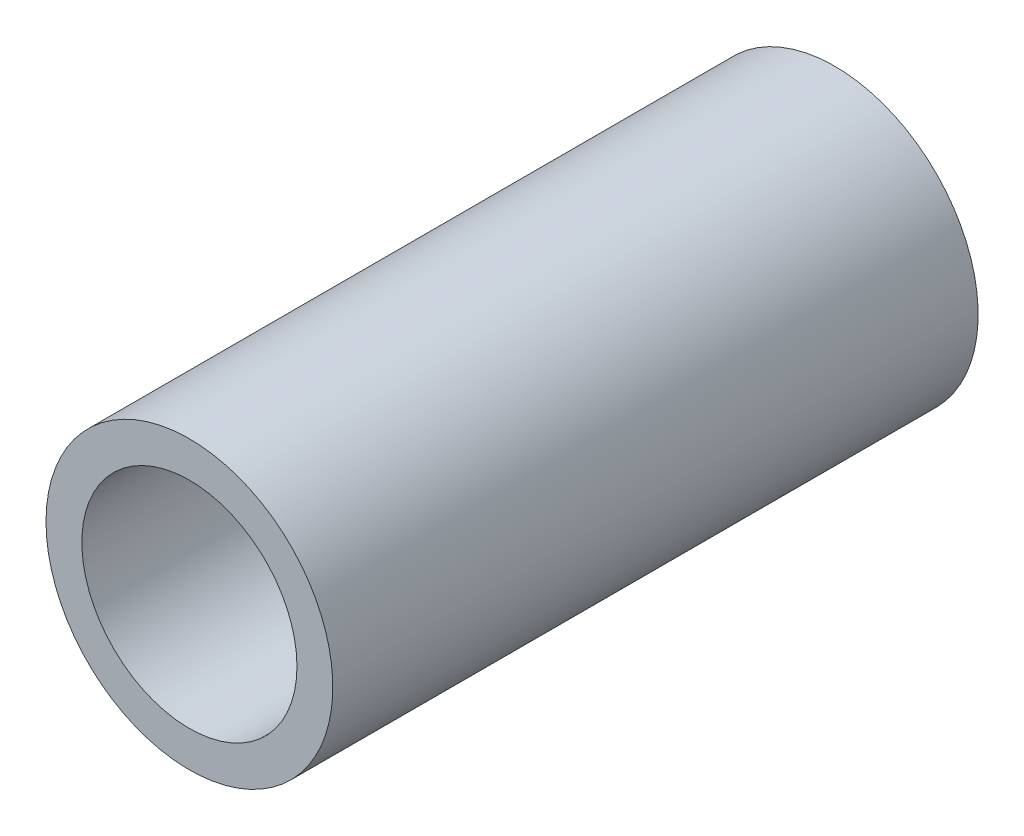
ISO-10303-21;
HEADER;
FILE_DESCRIPTION(('STEP AP214'),'2;1');
FILE_NAME('part.step','',(''),(''),'','','');
FILE_SCHEMA(('AUTOMOTIVE_DESIGN { 1 0 10303 214 1 1 1 1 }'));
ENDSEC;
DATA;
#1=APPLICATION_CONTEXT('core data for automotive mechanical design processes');
#2=APPLICATION_PROTOCOL_DEFINITION('international standard','automotive_design',2000,#1);
#3=PRODUCT_CONTEXT('',#1,'mechanical');
#4=PRODUCT('Part','Part','',(#3));
#5=PRODUCT_RELATED_PRODUCT_CATEGORY('part','',(#4));
#6=PRODUCT_DEFINITION_FORMATION('','',#4);
#7=PRODUCT_DEFINITION_CONTEXT('part definition',#1,'design');
#8=PRODUCT_DEFINITION('design','',#6,#7);
#9=PRODUCT_DEFINITION_SHAPE('','',#8);
#10=(LENGTH_UNIT() NAMED_UNIT(*) SI_UNIT(.MILLI.,.METRE.));
#11=(NAMED_UNIT(*) PLANE_ANGLE_UNIT() SI_UNIT($,.RADIAN.));
#12=(NAMED_UNIT(*) SI_UNIT($,.STERADIAN.) SOLID_ANGLE_UNIT());
#13=UNCERTAINTY_MEASURE_WITH_UNIT(LENGTH_MEASURE(1.E-05),#10,'distance_accuracy_value','');
#14=(GEOMETRIC_REPRESENTATION_CONTEXT(3) GLOBAL_UNCERTAINTY_ASSIGNED_CONTEXT((#13)) GLOBAL_UNIT_ASSIGNED_CONTEXT((#10,
#11,#12)) REPRESENTATION_CONTEXT('',''));
#15=CARTESIAN_POINT('',(0.,0.,0.));
#16=DIRECTION('',(0.,0.,1.));
#17=DIRECTION('',(1.,0.,0.));
#18=AXIS2_PLACEMENT_3D('',#15,#16,#17);
#19=CARTESIAN_POINT('',(0.,0.,90.));
#20=DIRECTION('',(0.,0.,-1.));
#21=DIRECTION('',(-1.,0.,0.));
#22=AXIS2_PLACEMENT_3D('',#19,#20,#21);
#23=CYLINDRICAL_SURFACE('',#22,20.);
#24=CARTESIAN_POINT('',(0.,0.,90.));
#25=DIRECTION('',(0.,0.,1.));
#26=DIRECTION('',(1.,0.,0.));
#27=AXIS2_PLACEMENT_3D('',#24,#25,#26);
#28=CIRCLE('',#27,20.);
#29=CARTESIAN_POINT('',(-20.,0.,90.));
#30=VERTEX_POINT('',#29);
#31=EDGE_CURVE('E10',#30,#30,#28,.T.);
#32=CARTESIAN_POINT('',(0.,0.,0.));
#33=DIRECTION('',(0.,0.,1.));
#34=DIRECTION('',(1.,0.,0.));
#35=AXIS2_PLACEMENT_3D('',#32,#33,#34);
#36=CIRCLE('',#35,20.);
#37=CARTESIAN_POINT('',(-20.,0.,0.));
#38=VERTEX_POINT('',#37);
#39=EDGE_CURVE('E34',#38,#38,#36,.T.);
#40=CARTESIAN_POINT('',(-20.,0.,90.));
#41=CARTESIAN_POINT('',(-20.,0.,89.0625));
#42=CARTESIAN_POINT('',(-20.,0.,88.125));
#43=CARTESIAN_POINT('',(-20.,0.,86.25));
#44=CARTESIAN_POINT('',(-20.,0.,85.3125));
#45=CARTESIAN_POINT('',(-20.,0.,83.4375));
#46=CARTESIAN_POINT('',(-20.,0.,82.5));
#47=CARTESIAN_POINT('',(-20.,0.,80.625));
#48=CARTESIAN_POINT('',(-20.,0.,79.6875));
#49=CARTESIAN_POINT('',(-20.,0.,77.8125));
#50=CARTESIAN_POINT('',(-20.,0.,76.875));
#51=CARTESIAN_POINT('',(-20.,0.,75.));
#52=CARTESIAN_POINT('',(-20.,0.,74.0625));
#53=CARTESIAN_POINT('',(-20.,0.,72.1875));
#54=CARTESIAN_POINT('',(-20.,0.,71.25));
#55=CARTESIAN_POINT('',(-20.,0.,69.375));
#56=CARTESIAN_POINT('',(-20.,0.,68.4375));
#57=CARTESIAN_POINT('',(-20.,0.,66.5625));
#58=CARTESIAN_POINT('',(-20.,0.,65.625));
#59=CARTESIAN_POINT('',(-20.,0.,63.75));
#60=CARTESIAN_POINT('',(-20.,0.,62.8125));
#61=CARTESIAN_POINT('',(-20.,0.,60.9375));
#62=CARTESIAN_POINT('',(-20.,0.,60.));
#63=CARTESIAN_POINT('',(-20.,0.,58.125));
#64=CARTESIAN_POINT('',(-20.,0.,57.1875));
#65=CARTESIAN_POINT('',(-20.,0.,55.3125));
#66=CARTESIAN_POINT('',(-20.,0.,54.375));
#67=CARTESIAN_POINT('',(-20.,0.,52.5));
#68=CARTESIAN_POINT('',(-20.,0.,51.5625));
#69=CARTESIAN_POINT('',(-20.,0.,49.6875));
#70=CARTESIAN_POINT('',(-20.,0.,48.75));
#71=CARTESIAN_POINT('',(-20.,0.,46.875));
#72=CARTESIAN_POINT('',(-20.,0.,45.9375));
#73=CARTESIAN_POINT('',(-20.,0.,44.0625));
#74=CARTESIAN_POINT('',(-20.,0.,43.125));
#75=CARTESIAN_POINT('',(-20.,0.,41.25));
#76=CARTESIAN_POINT('',(-20.,0.,40.3125));
#77=CARTESIAN_POINT('',(-20.,0.,38.4375));
#78=CARTESIAN_POINT('',(-20.,0.,37.5));
#79=CARTESIAN_POINT('',(-20.,0.,35.625));
#80=CARTESIAN_POINT('',(-20.,0.,34.6875));
#81=CARTESIAN_POINT('',(-20.,0.,32.8125));
#82=CARTESIAN_POINT('',(-20.,0.,31.875));
#83=CARTESIAN_POINT('',(-20.,0.,30.));
#84=CARTESIAN_POINT('',(-20.,0.,29.0625));
#85=CARTESIAN_POINT('',(-20.,0.,27.1875));
#86=CARTESIAN_POINT('',(-20.,0.,26.25));
#87=CARTESIAN_POINT('',(-20.,0.,24.375));
#88=CARTESIAN_POINT('',(-20.,0.,23.4375));
#89=CARTESIAN_POINT('',(-20.,0.,21.5625));
#90=CARTESIAN_POINT('',(-20.,0.,20.625));
#91=CARTESIAN_POINT('',(-20.,0.,18.75));
#92=CARTESIAN_POINT('',(-20.,0.,17.8125));
#93=CARTESIAN_POINT('',(-20.,0.,15.9375));
#94=CARTESIAN_POINT('',(-20.,0.,15.));
#95=CARTESIAN_POINT('',(-20.,0.,13.125));
#96=CARTESIAN_POINT('',(-20.,0.,12.1875));
#97=CARTESIAN_POINT('',(-20.,0.,10.3125));
#98=CARTESIAN_POINT('',(-20.,0.,9.37499999999999));
#99=CARTESIAN_POINT('',(-20.,0.,7.49999999999999));
#100=CARTESIAN_POINT('',(-20.,0.,6.56249999999999));
#101=CARTESIAN_POINT('',(-20.,0.,4.68749999999999));
#102=CARTESIAN_POINT('',(-20.,0.,3.74999999999998));
#103=CARTESIAN_POINT('',(-20.,0.,1.87499999999998));
#104=CARTESIAN_POINT('',(-20.,0.,0.937499999999986));
#105=CARTESIAN_POINT('',(-20.,0.,0.));
#106=B_SPLINE_CURVE_WITH_KNOTS('',3,(#40,#41,#42,#43,#44,#45,#46,#47,#48,#49,#50,#51,#52,#53,
#54,#55,#56,#57,#58,#59,#60,#61,#62,#63,#64,#65,#66,#67,#68,#69,#70,#71,#72,#73,#74,#75,#76,#77,
#78,#79,#80,#81,#82,#83,#84,#85,#86,#87,#88,#89,#90,#91,#92,#93,#94,#95,#96,#97,#98,#99,#100,
#101,#102,#103,#104,#105),.UNSPECIFIED.,.F.,.F.,(4,2,2,2,2,2,2,2,2,2,2,2,2,2,2,2,2,2,2,2,2,2,2,
2,2,2,2,2,2,2,2,2,4),(0.,2.81250000000001,5.62500000000001,8.43750000000001,11.25,14.0625,
16.875,19.6875,22.5,25.3125,28.125,30.9375,33.75,36.5625,39.375,42.1875,45.,47.8125,50.625,
53.4375,56.25,59.0625,61.875,64.6875,67.5,70.3125,73.125,75.9375,78.75,81.5625,84.375,87.1875,
90.),.UNSPECIFIED.);
#107=EDGE_CURVE('BSEAM31',#30,#38,#106,.T.);
#108=ORIENTED_EDGE('',*,*,#31,.F.);
#109=ORIENTED_EDGE('',*,*,#39,.T.);
#110=ORIENTED_EDGE('',*,*,#107,.T.);
#111=ORIENTED_EDGE('',*,*,#107,.F.);
#112=EDGE_LOOP('',(#108,#110,#109,#111));
#113=FACE_BOUND('',#112,.T.);
#114=ADVANCED_FACE('F31',(#113),#23,.T.);
#115=CARTESIAN_POINT('',(0.,0.,90.));
#116=DIRECTION('',(0.,0.,1.));
#117=DIRECTION('',(1.,0.,0.));
#118=AXIS2_PLACEMENT_3D('',#115,#116,#117);
#119=PLANE('',#118);
#120=CARTESIAN_POINT('',(0.,0.,90.));
#121=DIRECTION('',(0.,0.,1.));
#122=DIRECTION('',(1.,0.,0.));
#123=AXIS2_PLACEMENT_3D('',#120,#121,#122);
#124=CIRCLE('',#123,15.);
#125=CARTESIAN_POINT('',(15.,0.,90.));
#126=VERTEX_POINT('',#125);
#127=EDGE_CURVE('E43',#126,#126,#124,.T.);
#128=ORIENTED_EDGE('',*,*,#127,.F.);
#129=EDGE_LOOP('',(#128));
#130=FACE_BOUND('',#129,.T.);
#131=ORIENTED_EDGE('',*,*,#31,.T.);
#132=EDGE_LOOP('',(#131));
#133=FACE_BOUND('',#132,.T.);
#134=ADVANCED_FACE('F58',(#130,#133),#119,.T.);
#135=CARTESIAN_POINT('',(0.,0.,0.));
#136=DIRECTION('',(0.,0.,1.));
#137=DIRECTION('',(1.,0.,0.));
#138=AXIS2_PLACEMENT_3D('',#135,#136,#137);
#139=PLANE('',#138);
#140=CARTESIAN_POINT('',(0.,0.,0.));
#141=DIRECTION('',(0.,0.,1.));
#142=DIRECTION('',(1.,0.,0.));
#143=AXIS2_PLACEMENT_3D('',#140,#141,#142);
#144=CIRCLE('',#143,15.);
#145=CARTESIAN_POINT('',(15.,0.,0.));
#146=VERTEX_POINT('',#145);
#147=EDGE_CURVE('E41',#146,#146,#144,.T.);
#148=ORIENTED_EDGE('',*,*,#147,.T.);
#149=EDGE_LOOP('',(#148));
#150=FACE_BOUND('',#149,.T.);
#151=ORIENTED_EDGE('',*,*,#39,.F.);
#152=EDGE_LOOP('',(#151));
#153=FACE_BOUND('',#152,.T.);
#154=ADVANCED_FACE('F49',(#150,#153),#139,.F.);
#155=CARTESIAN_POINT('',(0.,0.,0.));
#156=DIRECTION('',(0.,0.,1.));
#157=DIRECTION('',(1.,0.,0.));
#158=AXIS2_PLACEMENT_3D('',#155,#156,#157);
#159=CYLINDRICAL_SURFACE('',#158,15.);
#160=CARTESIAN_POINT('',(15.,0.,0.));
#161=CARTESIAN_POINT('',(15.,0.,0.937499999999998));
#162=CARTESIAN_POINT('',(15.,0.,1.875));
#163=CARTESIAN_POINT('',(15.,0.,3.75));
#164=CARTESIAN_POINT('',(15.,0.,4.6875));
#165=CARTESIAN_POINT('',(15.,0.,6.5625));
#166=CARTESIAN_POINT('',(15.,0.,7.5));
#167=CARTESIAN_POINT('',(15.,0.,9.375));
#168=CARTESIAN_POINT('',(15.,0.,10.3125));
#169=CARTESIAN_POINT('',(15.,0.,12.1875));
#170=CARTESIAN_POINT('',(15.,0.,13.125));
#171=CARTESIAN_POINT('',(15.,0.,15.));
#172=CARTESIAN_POINT('',(15.,0.,15.9375));
#173=CARTESIAN_POINT('',(15.,0.,17.8125));
#174=CARTESIAN_POINT('',(15.,0.,18.75));
#175=CARTESIAN_POINT('',(15.,0.,20.625));
#176=CARTESIAN_POINT('',(15.,0.,21.5625));
#177=CARTESIAN_POINT('',(15.,0.,23.4375));
#178=CARTESIAN_POINT('',(15.,0.,24.375));
#179=CARTESIAN_POINT('',(15.,0.,26.25));
#180=CARTESIAN_POINT('',(15.,0.,27.1875));
#181=CARTESIAN_POINT('',(15.,0.,29.0625));
#182=CARTESIAN_POINT('',(15.,0.,30.));
#183=CARTESIAN_POINT('',(15.,0.,31.875));
#184=CARTESIAN_POINT('',(15.,0.,32.8125));
#185=CARTESIAN_POINT('',(15.,0.,34.6875));
#186=CARTESIAN_POINT('',(15.,0.,35.625));
#187=CARTESIAN_POINT('',(15.,0.,37.5));
#188=CARTESIAN_POINT('',(15.,0.,38.4375));
#189=CARTESIAN_POINT('',(15.,0.,40.3125));
#190=CARTESIAN_POINT('',(15.,0.,41.25));
#191=CARTESIAN_POINT('',(15.,0.,43.125));
#192=CARTESIAN_POINT('',(15.,0.,44.0625));
#193=CARTESIAN_POINT('',(15.,0.,45.9375));
#194=CARTESIAN_POINT('',(15.,0.,46.875));
#195=CARTESIAN_POINT('',(15.,0.,48.75));
#196=CARTESIAN_POINT('',(15.,0.,49.6875));
#197=CARTESIAN_POINT('',(15.,0.,51.5625));
#198=CARTESIAN_POINT('',(15.,0.,52.5));
#199=CARTESIAN_POINT('',(15.,0.,54.375));
#200=CARTESIAN_POINT('',(15.,0.,55.3125));
#201=CARTESIAN_POINT('',(15.,0.,57.1875));
#202=CARTESIAN_POINT('',(15.,0.,58.125));
#203=CARTESIAN_POINT('',(15.,0.,60.));
#204=CARTESIAN_POINT('',(15.,0.,60.9375));
#205=CARTESIAN_POINT('',(15.,0.,62.8125));
#206=CARTESIAN_POINT('',(15.,0.,63.75));
#207=CARTESIAN_POINT('',(15.,0.,65.625));
#208=CARTESIAN_POINT('',(15.,0.,66.5625));
#209=CARTESIAN_POINT('',(15.,0.,68.4375));
#210=CARTESIAN_POINT('',(15.,0.,69.375));
#211=CARTESIAN_POINT('',(15.,0.,71.25));
#212=CARTESIAN_POINT('',(15.,0.,72.1875));
#213=CARTESIAN_POINT('',(15.,0.,74.0625));
#214=CARTESIAN_POINT('',(15.,0.,75.));
#215=CARTESIAN_POINT('',(15.,0.,76.875));
#216=CARTESIAN_POINT('',(15.,0.,77.8125));
#217=CARTESIAN_POINT('',(15.,0.,79.6875));
#218=CARTESIAN_POINT('',(15.,0.,80.625));
#219=CARTESIAN_POINT('',(15.,0.,82.5));
#220=CARTESIAN_POINT('',(15.,0.,83.4375));
#221=CARTESIAN_POINT('',(15.,0.,85.3125));
#222=CARTESIAN_POINT('',(15.,0.,86.25));
#223=CARTESIAN_POINT('',(15.,0.,88.125));
#224=CARTESIAN_POINT('',(15.,0.,89.0625));
#225=CARTESIAN_POINT('',(15.,0.,90.));
#226=B_SPLINE_CURVE_WITH_KNOTS('',3,(#160,#161,#162,#163,#164,#165,#166,#167,#168,#169,#170,
#171,#172,#173,#174,#175,#176,#177,#178,#179,#180,#181,#182,#183,#184,#185,#186,#187,#188,#189,
#190,#191,#192,#193,#194,#195,#196,#197,#198,#199,#200,#201,#202,#203,#204,#205,#206,#207,#208,
#209,#210,#211,#212,#213,#214,#215,#216,#217,#218,#219,#220,#221,#222,#223,#224,#225),
.UNSPECIFIED.,.F.,.F.,(4,2,2,2,2,2,2,2,2,2,2,2,2,2,2,2,2,2,2,2,2,2,2,2,2,2,2,2,2,2,2,2,4),(0.,
2.8125,5.625,8.4375,11.25,14.0625,16.875,19.6875,22.5,25.3125,28.125,30.9375,33.75,36.5625,
39.375,42.1875,45.,47.8125,50.625,53.4375,56.25,59.0625,61.875,64.6875,67.5,70.3125,73.125,
75.9375,78.75,81.5625,84.375,87.1875,90.),.UNSPECIFIED.);
#227=EDGE_CURVE('BSEAM52',#146,#126,#226,.T.);
#228=ORIENTED_EDGE('',*,*,#147,.F.);
#229=ORIENTED_EDGE('',*,*,#127,.T.);
#230=ORIENTED_EDGE('',*,*,#227,.T.);
#231=ORIENTED_EDGE('',*,*,#227,.F.);
#232=EDGE_LOOP('',(#228,#230,#229,#231));
#233=FACE_BOUND('',#232,.T.);
#234=ADVANCED_FACE('F52',(#233),#159,.F.);
#235=CLOSED_SHELL('',(#114,#134,#154,#234));
#236=MANIFOLD_SOLID_BREP('B2',#235);
#237=ADVANCED_BREP_SHAPE_REPRESENTATION('',(#18,#236),#14);
#238=SHAPE_DEFINITION_REPRESENTATION(#9,#237);
ENDSEC;
END-ISO-10303-21;
